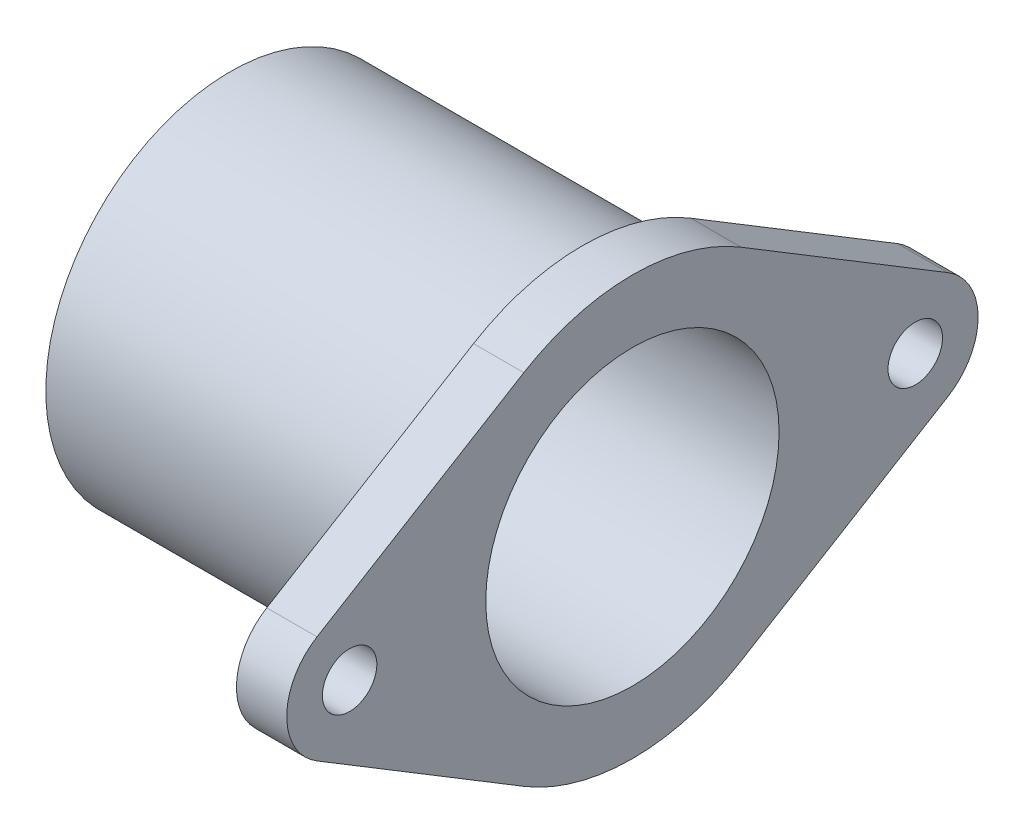
ISO-10303-21;
HEADER;
FILE_DESCRIPTION(('STEP AP214'),'2;1');
FILE_NAME('part.step','',(''),(''),'','','');
FILE_SCHEMA(('AUTOMOTIVE_DESIGN { 1 0 10303 214 1 1 1 1 }'));
ENDSEC;
DATA;
#1=APPLICATION_CONTEXT('core data for automotive mechanical design processes');
#2=APPLICATION_PROTOCOL_DEFINITION('international standard','automotive_design',2000,#1);
#3=PRODUCT_CONTEXT('',#1,'mechanical');
#4=PRODUCT('Part','Part','',(#3));
#5=PRODUCT_RELATED_PRODUCT_CATEGORY('part','',(#4));
#6=PRODUCT_DEFINITION_FORMATION('','',#4);
#7=PRODUCT_DEFINITION_CONTEXT('part definition',#1,'design');
#8=PRODUCT_DEFINITION('design','',#6,#7);
#9=PRODUCT_DEFINITION_SHAPE('','',#8);
#10=(LENGTH_UNIT() NAMED_UNIT(*) SI_UNIT(.MILLI.,.METRE.));
#11=(NAMED_UNIT(*) PLANE_ANGLE_UNIT() SI_UNIT($,.RADIAN.));
#12=(NAMED_UNIT(*) SI_UNIT($,.STERADIAN.) SOLID_ANGLE_UNIT());
#13=UNCERTAINTY_MEASURE_WITH_UNIT(LENGTH_MEASURE(1.E-05),#10,'distance_accuracy_value','');
#14=(GEOMETRIC_REPRESENTATION_CONTEXT(3) GLOBAL_UNCERTAINTY_ASSIGNED_CONTEXT((#13)) GLOBAL_UNIT_ASSIGNED_CONTEXT((#10,
#11,#12)) REPRESENTATION_CONTEXT('',''));
#15=CARTESIAN_POINT('',(0.,0.,0.));
#16=DIRECTION('',(0.,0.,1.));
#17=DIRECTION('',(1.,0.,0.));
#18=AXIS2_PLACEMENT_3D('',#15,#16,#17);
#19=CARTESIAN_POINT('',(84.,0.,0.));
#20=DIRECTION('',(-1.,0.,0.));
#21=DIRECTION('',(0.,0.,-0.999999999999999));
#22=AXIS2_PLACEMENT_3D('',#19,#20,#21);
#23=CYLINDRICAL_SURFACE('',#22,44.);
#24=CARTESIAN_POINT('',(84.,0.,0.));
#25=DIRECTION('',(-1.,0.,0.));
#26=DIRECTION('',(0.,0.,0.999999999999999));
#27=AXIS2_PLACEMENT_3D('',#24,#25,#26);
#28=CIRCLE('',#27,44.);
#29=CARTESIAN_POINT('',(84.,0.,-44.));
#30=VERTEX_POINT('',#29);
#31=EDGE_CURVE('E11',#30,#30,#28,.T.);
#32=CARTESIAN_POINT('',(0.,0.,0.));
#33=DIRECTION('',(-1.,0.,0.));
#34=DIRECTION('',(0.,0.,0.999999999999999));
#35=AXIS2_PLACEMENT_3D('',#32,#33,#34);
#36=CIRCLE('',#35,44.);
#37=CARTESIAN_POINT('',(0.,0.,-44.));
#38=VERTEX_POINT('',#37);
#39=EDGE_CURVE('E46',#38,#38,#36,.T.);
#40=CARTESIAN_POINT('',(84.,0.,-44.));
#41=CARTESIAN_POINT('',(83.125,0.,-44.));
#42=CARTESIAN_POINT('',(82.25,0.,-44.));
#43=CARTESIAN_POINT('',(80.5,0.,-44.));
#44=CARTESIAN_POINT('',(79.625,0.,-44.));
#45=CARTESIAN_POINT('',(77.875,0.,-44.));
#46=CARTESIAN_POINT('',(77.,0.,-44.));
#47=CARTESIAN_POINT('',(75.25,0.,-44.));
#48=CARTESIAN_POINT('',(74.375,0.,-44.));
#49=CARTESIAN_POINT('',(72.625,0.,-44.));
#50=CARTESIAN_POINT('',(71.75,0.,-44.));
#51=CARTESIAN_POINT('',(70.,0.,-44.));
#52=CARTESIAN_POINT('',(69.125,0.,-44.));
#53=CARTESIAN_POINT('',(67.375,0.,-44.));
#54=CARTESIAN_POINT('',(66.5,0.,-44.));
#55=CARTESIAN_POINT('',(64.75,0.,-44.));
#56=CARTESIAN_POINT('',(63.875,0.,-44.));
#57=CARTESIAN_POINT('',(62.125,0.,-44.));
#58=CARTESIAN_POINT('',(61.25,0.,-44.));
#59=CARTESIAN_POINT('',(59.5,0.,-44.));
#60=CARTESIAN_POINT('',(58.625,0.,-44.));
#61=CARTESIAN_POINT('',(56.875,0.,-44.));
#62=CARTESIAN_POINT('',(56.,0.,-44.));
#63=CARTESIAN_POINT('',(54.25,0.,-44.));
#64=CARTESIAN_POINT('',(53.375,0.,-44.));
#65=CARTESIAN_POINT('',(51.625,0.,-44.));
#66=CARTESIAN_POINT('',(50.75,0.,-44.));
#67=CARTESIAN_POINT('',(49.,0.,-44.));
#68=CARTESIAN_POINT('',(48.125,0.,-44.));
#69=CARTESIAN_POINT('',(46.375,0.,-44.));
#70=CARTESIAN_POINT('',(45.5,0.,-44.));
#71=CARTESIAN_POINT('',(43.75,0.,-44.));
#72=CARTESIAN_POINT('',(42.875,0.,-44.));
#73=CARTESIAN_POINT('',(41.125,0.,-44.));
#74=CARTESIAN_POINT('',(40.25,0.,-44.));
#75=CARTESIAN_POINT('',(38.5,0.,-44.));
#76=CARTESIAN_POINT('',(37.625,0.,-44.));
#77=CARTESIAN_POINT('',(35.875,0.,-44.));
#78=CARTESIAN_POINT('',(35.,0.,-44.));
#79=CARTESIAN_POINT('',(33.25,0.,-44.));
#80=CARTESIAN_POINT('',(32.375,0.,-44.));
#81=CARTESIAN_POINT('',(30.625,0.,-44.));
#82=CARTESIAN_POINT('',(29.75,0.,-44.));
#83=CARTESIAN_POINT('',(28.,0.,-44.));
#84=CARTESIAN_POINT('',(27.125,0.,-44.));
#85=CARTESIAN_POINT('',(25.375,0.,-44.));
#86=CARTESIAN_POINT('',(24.5,0.,-44.));
#87=CARTESIAN_POINT('',(22.75,0.,-44.));
#88=CARTESIAN_POINT('',(21.875,0.,-44.));
#89=CARTESIAN_POINT('',(20.125,0.,-44.));
#90=CARTESIAN_POINT('',(19.25,0.,-44.));
#91=CARTESIAN_POINT('',(17.5,0.,-44.));
#92=CARTESIAN_POINT('',(16.625,0.,-44.));
#93=CARTESIAN_POINT('',(14.875,0.,-44.));
#94=CARTESIAN_POINT('',(14.,0.,-44.));
#95=CARTESIAN_POINT('',(12.25,0.,-44.));
#96=CARTESIAN_POINT('',(11.375,0.,-44.));
#97=CARTESIAN_POINT('',(9.62499999999998,0.,-44.));
#98=CARTESIAN_POINT('',(8.74999999999998,0.,-44.));
#99=CARTESIAN_POINT('',(6.99999999999998,0.,-44.));
#100=CARTESIAN_POINT('',(6.12499999999999,0.,-44.));
#101=CARTESIAN_POINT('',(4.37499999999999,0.,-44.));
#102=CARTESIAN_POINT('',(3.49999999999999,0.,-44.));
#103=CARTESIAN_POINT('',(1.74999999999999,0.,-44.));
#104=CARTESIAN_POINT('',(0.874999999999986,0.,-44.));
#105=CARTESIAN_POINT('',(0.,0.,-44.));
#106=B_SPLINE_CURVE_WITH_KNOTS('',3,(#40,#41,#42,#43,#44,#45,#46,#47,#48,#49,#50,#51,#52,#53,
#54,#55,#56,#57,#58,#59,#60,#61,#62,#63,#64,#65,#66,#67,#68,#69,#70,#71,#72,#73,#74,#75,#76,#77,
#78,#79,#80,#81,#82,#83,#84,#85,#86,#87,#88,#89,#90,#91,#92,#93,#94,#95,#96,#97,#98,#99,#100,
#101,#102,#103,#104,#105),.UNSPECIFIED.,.F.,.F.,(4,2,2,2,2,2,2,2,2,2,2,2,2,2,2,2,2,2,2,2,2,2,2,
2,2,2,2,2,2,2,2,2,4),(0.,2.625,5.25,7.87500000000001,10.5,13.125,15.75,18.375,21.,23.625,26.25,
28.875,31.5,34.125,36.75,39.375,42.,44.625,47.25,49.875,52.5,55.125,57.75,60.375,63.,65.625,
68.25,70.875,73.5,76.125,78.75,81.375,84.),.UNSPECIFIED.);
#107=EDGE_CURVE('BSEAM37',#30,#38,#106,.T.);
#108=ORIENTED_EDGE('',*,*,#31,.T.);
#109=ORIENTED_EDGE('',*,*,#39,.F.);
#110=ORIENTED_EDGE('',*,*,#107,.T.);
#111=ORIENTED_EDGE('',*,*,#107,.F.);
#112=EDGE_LOOP('',(#108,#110,#109,#111));
#113=FACE_BOUND('',#112,.T.);
#114=ADVANCED_FACE('F37',(#113),#23,.T.);
#115=CARTESIAN_POINT('',(0.,0.,0.));
#116=DIRECTION('',(1.,0.,0.));
#117=DIRECTION('',(0.,0.,0.999999999999999));
#118=AXIS2_PLACEMENT_3D('',#115,#116,#117);
#119=PLANE('',#118);
#120=CARTESIAN_POINT('',(0.,0.,0.));
#121=DIRECTION('',(1.,0.,0.));
#122=DIRECTION('',(0.,0.,-0.999999999999999));
#123=AXIS2_PLACEMENT_3D('',#120,#121,#122);
#124=CIRCLE('',#123,25.25);
#125=CARTESIAN_POINT('',(0.,0.,-25.25));
#126=VERTEX_POINT('',#125);
#127=EDGE_CURVE('E251',#126,#126,#124,.T.);
#128=ORIENTED_EDGE('',*,*,#127,.T.);
#129=EDGE_LOOP('',(#128));
#130=FACE_BOUND('',#129,.T.);
#131=ORIENTED_EDGE('',*,*,#39,.T.);
#132=EDGE_LOOP('',(#131));
#133=FACE_BOUND('',#132,.T.);
#134=ADVANCED_FACE('F168',(#130,#133),#119,.F.);
#135=CARTESIAN_POINT('',(84.,0.,0.));
#136=DIRECTION('',(1.,0.,0.));
#137=DIRECTION('',(0.,0.,0.999999999999999));
#138=AXIS2_PLACEMENT_3D('',#135,#136,#137);
#139=PLANE('',#138);
#140=CARTESIAN_POINT('',(84.0000000000005,0.,-67.5000000000003));
#141=DIRECTION('',(-1.,0.,0.));
#142=DIRECTION('',(0.,0.,0.999999999999999));
#143=AXIS2_PLACEMENT_3D('',#140,#141,#142);
#144=CIRCLE('',#143,6.5);
#145=CARTESIAN_POINT('',(84.0000000000005,0.,-61.0000000000003));
#146=VERTEX_POINT('',#145);
#147=EDGE_CURVE('E239',#146,#146,#144,.T.);
#148=ORIENTED_EDGE('',*,*,#147,.F.);
#149=EDGE_LOOP('',(#148));
#150=FACE_BOUND('',#149,.T.);
#151=CARTESIAN_POINT('',(84.0000000000009,1.77635683940025E-12,67.4999999999963));
#152=DIRECTION('',(-1.,0.,0.));
#153=DIRECTION('',(0.,0.,0.999999999999999));
#154=AXIS2_PLACEMENT_3D('',#151,#152,#153);
#155=CIRCLE('',#154,6.5);
#156=CARTESIAN_POINT('',(84.0000000000009,1.77635683940025E-12,73.9999999999963));
#157=VERTEX_POINT('',#156);
#158=EDGE_CURVE('E137',#157,#157,#155,.T.);
#159=ORIENTED_EDGE('',*,*,#158,.F.);
#160=EDGE_LOOP('',(#159));
#161=FACE_BOUND('',#160,.T.);
#162=CARTESIAN_POINT('',(84.,0.,0.));
#163=DIRECTION('',(-1.,0.,0.));
#164=DIRECTION('',(0.,0.,0.999999999999999));
#165=AXIS2_PLACEMENT_3D('',#162,#163,#164);
#166=CIRCLE('',#165,50.);
#167=CARTESIAN_POINT('',(84.0000000000001,42.7533199282042,25.9259259259226));
#168=VERTEX_POINT('',#167);
#169=CARTESIAN_POINT('',(84.0000000000004,42.7533199282046,-25.9259259259292));
#170=VERTEX_POINT('',#169);
#171=EDGE_CURVE('E133',#168,#170,#166,.T.);
#172=ORIENTED_EDGE('',*,*,#171,.T.);
#173=DIRECTION('',(0.,-0.518518518518518,-0.855066398564088));
#174=VECTOR('',#173,1.);
#175=CARTESIAN_POINT('',(84.0000000000004,42.7533199282046,-25.9259259259292));
#176=LINE('',#175,#174);
#177=CARTESIAN_POINT('',(84.0000000000001,12.8259959784622,-75.2777777777793));
#178=VERTEX_POINT('',#177);
#179=EDGE_CURVE('E136',#170,#178,#176,.T.);
#180=ORIENTED_EDGE('',*,*,#179,.T.);
#181=CARTESIAN_POINT('',(84.0000000000005,0.,-67.5000000000003));
#182=DIRECTION('',(-1.,0.,0.));
#183=DIRECTION('',(0.,0.,0.999999999999999));
#184=AXIS2_PLACEMENT_3D('',#181,#182,#183);
#185=CIRCLE('',#184,15.);
#186=CARTESIAN_POINT('',(84.0000000000001,-12.8259959784596,-75.2777777777811));
#187=VERTEX_POINT('',#186);
#188=EDGE_CURVE('E140',#178,#187,#185,.T.);
#189=ORIENTED_EDGE('',*,*,#188,.T.);
#190=DIRECTION('',(0.,-0.518518518518516,0.855066398564088));
#191=VECTOR('',#190,1.);
#192=CARTESIAN_POINT('',(84.0000000000001,-12.8259959784596,-75.2777777777811));
#193=LINE('',#192,#191);
#194=CARTESIAN_POINT('',(84.0000000000013,-42.7533199282024,-25.9259259259292));
#195=VERTEX_POINT('',#194);
#196=EDGE_CURVE('E143',#187,#195,#193,.T.);
#197=ORIENTED_EDGE('',*,*,#196,.T.);
#198=CARTESIAN_POINT('',(84.,0.,0.));
#199=DIRECTION('',(-1.,0.,0.));
#200=DIRECTION('',(0.,0.,0.999999999999999));
#201=AXIS2_PLACEMENT_3D('',#198,#199,#200);
#202=CIRCLE('',#201,50.);
#203=CARTESIAN_POINT('',(84.000000000001,-42.7533199282033,25.9259259259226));
#204=VERTEX_POINT('',#203);
#205=EDGE_CURVE('E146',#195,#204,#202,.T.);
#206=ORIENTED_EDGE('',*,*,#205,.T.);
#207=DIRECTION('',(0.,0.518518518518519,0.855066398564088));
#208=VECTOR('',#207,1.);
#209=CARTESIAN_POINT('',(84.0000000000009,-12.8259959784631,75.2777777777784));
#210=LINE('',#209,#208);
#211=CARTESIAN_POINT('',(84.0000000000009,-12.8259959784631,75.2777777777784));
#212=VERTEX_POINT('',#211);
#213=EDGE_CURVE('E149',#204,#212,#210,.T.);
#214=ORIENTED_EDGE('',*,*,#213,.T.);
#215=CARTESIAN_POINT('',(84.0000000000009,1.77635683940025E-12,67.4999999999963));
#216=DIRECTION('',(-1.,0.,0.));
#217=DIRECTION('',(0.,0.,0.999999999999999));
#218=AXIS2_PLACEMENT_3D('',#215,#216,#217);
#219=CIRCLE('',#218,15.);
#220=CARTESIAN_POINT('',(84.0000000000009,12.8259959784649,75.2777777777744));
#221=VERTEX_POINT('',#220);
#222=EDGE_CURVE('E118',#212,#221,#219,.T.);
#223=ORIENTED_EDGE('',*,*,#222,.T.);
#224=DIRECTION('',(0.,0.518518518518517,-0.855066398564088));
#225=VECTOR('',#224,1.);
#226=CARTESIAN_POINT('',(84.0000000000001,42.7533199282042,25.9259259259226));
#227=LINE('',#226,#225);
#228=EDGE_CURVE('E152',#221,#168,#227,.T.);
#229=ORIENTED_EDGE('',*,*,#228,.T.);
#230=EDGE_LOOP('',(#172,#180,#189,#197,#206,#214,#223,#229));
#231=FACE_BOUND('',#230,.T.);
#232=ORIENTED_EDGE('',*,*,#31,.F.);
#233=EDGE_LOOP('',(#232));
#234=FACE_BOUND('',#233,.T.);
#235=ADVANCED_FACE('F175',(#150,#161,#231,#234),#139,.F.);
#236=CARTESIAN_POINT('',(96.,0.,0.));
#237=DIRECTION('',(-1.,0.,0.));
#238=DIRECTION('',(0.,0.,-0.999999999999999));
#239=AXIS2_PLACEMENT_3D('',#236,#237,#238);
#240=CYLINDRICAL_SURFACE('',#239,50.);
#241=ORIENTED_EDGE('',*,*,#171,.F.);
#242=DIRECTION('',(-1.,0.,0.));
#243=VECTOR('',#242,1.);
#244=CARTESIAN_POINT('',(96.0000000000004,42.7533199282042,25.9259259259226));
#245=LINE('',#244,#243);
#246=CARTESIAN_POINT('',(96.0000000000004,42.7533199282042,25.9259259259226));
#247=VERTEX_POINT('',#246);
#248=EDGE_CURVE('E87',#247,#168,#245,.T.);
#249=ORIENTED_EDGE('',*,*,#248,.F.);
#250=CARTESIAN_POINT('',(96.,0.,0.));
#251=DIRECTION('',(-1.,0.,0.));
#252=DIRECTION('',(0.,0.,0.999999999999999));
#253=AXIS2_PLACEMENT_3D('',#250,#251,#252);
#254=CIRCLE('',#253,50.);
#255=CARTESIAN_POINT('',(96.0000000000004,42.7533199282046,-25.9259259259292));
#256=VERTEX_POINT('',#255);
#257=EDGE_CURVE('E154',#247,#256,#254,.T.);
#258=ORIENTED_EDGE('',*,*,#257,.T.);
#259=DIRECTION('',(-1.,0.,0.));
#260=VECTOR('',#259,1.);
#261=CARTESIAN_POINT('',(96.0000000000004,42.7533199282046,-25.9259259259292));
#262=LINE('',#261,#260);
#263=EDGE_CURVE('E164',#256,#170,#262,.T.);
#264=ORIENTED_EDGE('',*,*,#263,.T.);
#265=EDGE_LOOP('',(#241,#249,#258,#264));
#266=FACE_BOUND('',#265,.T.);
#267=ADVANCED_FACE('F180',(#266),#240,.T.);
#268=CARTESIAN_POINT('',(96.0000000000004,42.7533199282046,-25.9259259259292));
#269=DIRECTION('',(0.,-0.855066398564088,0.518518518518518));
#270=DIRECTION('',(0.,0.518518518518518,0.855066398564088));
#271=AXIS2_PLACEMENT_3D('',#268,#269,#270);
#272=PLANE('',#271);
#273=ORIENTED_EDGE('',*,*,#179,.F.);
#274=ORIENTED_EDGE('',*,*,#263,.F.);
#275=DIRECTION('',(0.,-0.518518518518518,-0.855066398564088));
#276=VECTOR('',#275,1.);
#277=CARTESIAN_POINT('',(96.0000000000004,42.7533199282046,-25.9259259259292));
#278=LINE('',#277,#276);
#279=CARTESIAN_POINT('',(95.9999999999996,12.8259959784618,-75.2777777777793));
#280=VERTEX_POINT('',#279);
#281=EDGE_CURVE('E95',#256,#280,#278,.T.);
#282=ORIENTED_EDGE('',*,*,#281,.T.);
#283=DIRECTION('',(-1.,0.,0.));
#284=VECTOR('',#283,1.);
#285=CARTESIAN_POINT('',(95.9999999999996,12.8259959784618,-75.2777777777793));
#286=LINE('',#285,#284);
#287=EDGE_CURVE('E162',#280,#178,#286,.T.);
#288=ORIENTED_EDGE('',*,*,#287,.T.);
#289=EDGE_LOOP('',(#273,#274,#282,#288));
#290=FACE_BOUND('',#289,.T.);
#291=ADVANCED_FACE('F186',(#290),#272,.F.);
#292=CARTESIAN_POINT('',(96.0000000000005,0.,-67.5000000000003));
#293=DIRECTION('',(-1.,0.,0.));
#294=DIRECTION('',(0.,0.,-0.999999999999999));
#295=AXIS2_PLACEMENT_3D('',#292,#293,#294);
#296=CYLINDRICAL_SURFACE('',#295,15.);
#297=ORIENTED_EDGE('',*,*,#188,.F.);
#298=ORIENTED_EDGE('',*,*,#287,.F.);
#299=CARTESIAN_POINT('',(96.0000000000005,0.,-67.5000000000003));
#300=DIRECTION('',(-1.,0.,0.));
#301=DIRECTION('',(0.,0.,0.999999999999999));
#302=AXIS2_PLACEMENT_3D('',#299,#300,#301);
#303=CIRCLE('',#302,15.);
#304=CARTESIAN_POINT('',(95.9999999999996,-12.8259959784596,-75.2777777777811));
#305=VERTEX_POINT('',#304);
#306=EDGE_CURVE('E224',#280,#305,#303,.T.);
#307=ORIENTED_EDGE('',*,*,#306,.T.);
#308=DIRECTION('',(-1.,0.,0.));
#309=VECTOR('',#308,1.);
#310=CARTESIAN_POINT('',(95.9999999999996,-12.8259959784596,-75.2777777777811));
#311=LINE('',#310,#309);
#312=EDGE_CURVE('E160',#305,#187,#311,.T.);
#313=ORIENTED_EDGE('',*,*,#312,.T.);
#314=EDGE_LOOP('',(#297,#298,#307,#313));
#315=FACE_BOUND('',#314,.T.);
#316=ADVANCED_FACE('F208',(#315),#296,.T.);
#317=CARTESIAN_POINT('',(95.9999999999996,-12.8259959784596,-75.2777777777811));
#318=DIRECTION('',(0.,0.855066398564088,0.518518518518516));
#319=DIRECTION('',(0.,0.518518518518517,-0.855066398564088));
#320=AXIS2_PLACEMENT_3D('',#317,#318,#319);
#321=PLANE('',#320);
#322=ORIENTED_EDGE('',*,*,#196,.F.);
#323=ORIENTED_EDGE('',*,*,#312,.F.);
#324=DIRECTION('',(0.,-0.518518518518516,0.855066398564088));
#325=VECTOR('',#324,1.);
#326=CARTESIAN_POINT('',(95.9999999999996,-12.8259959784596,-75.2777777777811));
#327=LINE('',#326,#325);
#328=CARTESIAN_POINT('',(96.0000000000013,-42.7533199282024,-25.9259259259292));
#329=VERTEX_POINT('',#328);
#330=EDGE_CURVE('E128',#305,#329,#327,.T.);
#331=ORIENTED_EDGE('',*,*,#330,.T.);
#332=DIRECTION('',(-1.,0.,0.));
#333=VECTOR('',#332,1.);
#334=CARTESIAN_POINT('',(96.0000000000013,-42.7533199282024,-25.9259259259292));
#335=LINE('',#334,#333);
#336=EDGE_CURVE('E158',#329,#195,#335,.T.);
#337=ORIENTED_EDGE('',*,*,#336,.T.);
#338=EDGE_LOOP('',(#322,#323,#331,#337));
#339=FACE_BOUND('',#338,.T.);
#340=ADVANCED_FACE('F204',(#339),#321,.F.);
#341=CARTESIAN_POINT('',(96.,0.,0.));
#342=DIRECTION('',(-1.,0.,0.));
#343=DIRECTION('',(0.,0.,-0.999999999999999));
#344=AXIS2_PLACEMENT_3D('',#341,#342,#343);
#345=CYLINDRICAL_SURFACE('',#344,50.);
#346=ORIENTED_EDGE('',*,*,#205,.F.);
#347=ORIENTED_EDGE('',*,*,#336,.F.);
#348=CARTESIAN_POINT('',(96.,0.,0.));
#349=DIRECTION('',(-1.,0.,0.));
#350=DIRECTION('',(0.,0.,0.999999999999999));
#351=AXIS2_PLACEMENT_3D('',#348,#349,#350);
#352=CIRCLE('',#351,50.);
#353=CARTESIAN_POINT('',(96.0000000000013,-42.7533199282033,25.9259259259226));
#354=VERTEX_POINT('',#353);
#355=EDGE_CURVE('E126',#329,#354,#352,.T.);
#356=ORIENTED_EDGE('',*,*,#355,.T.);
#357=DIRECTION('',(-1.,0.,0.));
#358=VECTOR('',#357,1.);
#359=CARTESIAN_POINT('',(96.0000000000013,-42.7533199282033,25.9259259259226));
#360=LINE('',#359,#358);
#361=EDGE_CURVE('E122',#354,#204,#360,.T.);
#362=ORIENTED_EDGE('',*,*,#361,.T.);
#363=EDGE_LOOP('',(#346,#347,#356,#362));
#364=FACE_BOUND('',#363,.T.);
#365=ADVANCED_FACE('F201',(#364),#345,.T.);
#366=CARTESIAN_POINT('',(96.0000000000004,-12.8259959784631,75.2777777777776));
#367=DIRECTION('',(0.,0.855066398564088,-0.518518518518518));
#368=DIRECTION('',(0.,-0.518518518518519,-0.855066398564088));
#369=AXIS2_PLACEMENT_3D('',#366,#367,#368);
#370=PLANE('',#369);
#371=ORIENTED_EDGE('',*,*,#213,.F.);
#372=ORIENTED_EDGE('',*,*,#361,.F.);
#373=DIRECTION('',(0.,0.518518518518519,0.855066398564088));
#374=VECTOR('',#373,1.);
#375=CARTESIAN_POINT('',(96.0000000000004,-12.8259959784631,75.2777777777776));
#376=LINE('',#375,#374);
#377=CARTESIAN_POINT('',(96.0000000000004,-12.8259959784631,75.2777777777776));
#378=VERTEX_POINT('',#377);
#379=EDGE_CURVE('E112',#354,#378,#376,.T.);
#380=ORIENTED_EDGE('',*,*,#379,.T.);
#381=DIRECTION('',(-1.,0.,0.));
#382=VECTOR('',#381,1.);
#383=CARTESIAN_POINT('',(96.0000000000004,-12.8259959784631,75.2777777777776));
#384=LINE('',#383,#382);
#385=EDGE_CURVE('E115',#378,#212,#384,.T.);
#386=ORIENTED_EDGE('',*,*,#385,.T.);
#387=EDGE_LOOP('',(#371,#372,#380,#386));
#388=FACE_BOUND('',#387,.T.);
#389=ADVANCED_FACE('F124',(#388),#370,.F.);
#390=CARTESIAN_POINT('',(96.0000000000009,1.77635683940025E-12,67.4999999999963));
#391=DIRECTION('',(-1.,0.,0.));
#392=DIRECTION('',(0.,0.,-0.999999999999999));
#393=AXIS2_PLACEMENT_3D('',#390,#391,#392);
#394=CYLINDRICAL_SURFACE('',#393,15.);
#395=ORIENTED_EDGE('',*,*,#222,.F.);
#396=ORIENTED_EDGE('',*,*,#385,.F.);
#397=CARTESIAN_POINT('',(96.0000000000009,1.77635683940025E-12,67.4999999999963));
#398=DIRECTION('',(-1.,0.,0.));
#399=DIRECTION('',(0.,0.,0.999999999999999));
#400=AXIS2_PLACEMENT_3D('',#397,#398,#399);
#401=CIRCLE('',#400,15.);
#402=CARTESIAN_POINT('',(96.0000000000004,12.8259959784649,75.2777777777744));
#403=VERTEX_POINT('',#402);
#404=EDGE_CURVE('E108',#378,#403,#401,.T.);
#405=ORIENTED_EDGE('',*,*,#404,.T.);
#406=DIRECTION('',(-1.,0.,0.));
#407=VECTOR('',#406,1.);
#408=CARTESIAN_POINT('',(96.0000000000004,12.8259959784649,75.2777777777744));
#409=LINE('',#408,#407);
#410=EDGE_CURVE('E83',#403,#221,#409,.T.);
#411=ORIENTED_EDGE('',*,*,#410,.T.);
#412=EDGE_LOOP('',(#395,#396,#405,#411));
#413=FACE_BOUND('',#412,.T.);
#414=ADVANCED_FACE('F116',(#413),#394,.T.);
#415=CARTESIAN_POINT('',(96.0000000000004,42.7533199282042,25.9259259259226));
#416=DIRECTION('',(0.,-0.855066398564088,-0.518518518518517));
#417=DIRECTION('',(0.,-0.518518518518517,0.855066398564088));
#418=AXIS2_PLACEMENT_3D('',#415,#416,#417);
#419=PLANE('',#418);
#420=ORIENTED_EDGE('',*,*,#228,.F.);
#421=ORIENTED_EDGE('',*,*,#410,.F.);
#422=DIRECTION('',(0.,0.518518518518517,-0.855066398564088));
#423=VECTOR('',#422,1.);
#424=CARTESIAN_POINT('',(96.0000000000004,42.7533199282042,25.9259259259226));
#425=LINE('',#424,#423);
#426=EDGE_CURVE('E55',#403,#247,#425,.T.);
#427=ORIENTED_EDGE('',*,*,#426,.T.);
#428=ORIENTED_EDGE('',*,*,#248,.T.);
#429=EDGE_LOOP('',(#420,#421,#427,#428));
#430=FACE_BOUND('',#429,.T.);
#431=ADVANCED_FACE('F194',(#430),#419,.F.);
#432=CARTESIAN_POINT('',(96.,0.,0.));
#433=DIRECTION('',(1.,0.,0.));
#434=DIRECTION('',(0.,0.,0.999999999999999));
#435=AXIS2_PLACEMENT_3D('',#432,#433,#434);
#436=PLANE('',#435);
#437=CARTESIAN_POINT('',(96.,0.,0.));
#438=DIRECTION('',(-1.,0.,0.));
#439=DIRECTION('',(0.,0.,0.999999999999999));
#440=AXIS2_PLACEMENT_3D('',#437,#438,#439);
#441=CIRCLE('',#440,35.);
#442=CARTESIAN_POINT('',(96.,0.,35.));
#443=VERTEX_POINT('',#442);
#444=EDGE_CURVE('E246',#443,#443,#441,.T.);
#445=ORIENTED_EDGE('',*,*,#444,.T.);
#446=EDGE_LOOP('',(#445));
#447=FACE_BOUND('',#446,.T.);
#448=CARTESIAN_POINT('',(96.0000000000005,0.,-67.5000000000003));
#449=DIRECTION('',(-1.,0.,0.));
#450=DIRECTION('',(0.,0.,0.999999999999999));
#451=AXIS2_PLACEMENT_3D('',#448,#449,#450);
#452=CIRCLE('',#451,6.5);
#453=CARTESIAN_POINT('',(96.0000000000005,0.,-61.0000000000003));
#454=VERTEX_POINT('',#453);
#455=EDGE_CURVE('E242',#454,#454,#452,.T.);
#456=ORIENTED_EDGE('',*,*,#455,.T.);
#457=EDGE_LOOP('',(#456));
#458=FACE_BOUND('',#457,.T.);
#459=CARTESIAN_POINT('',(96.0000000000009,1.77635683940025E-12,67.4999999999963));
#460=DIRECTION('',(-1.,0.,0.));
#461=DIRECTION('',(0.,0.,0.999999999999999));
#462=AXIS2_PLACEMENT_3D('',#459,#460,#461);
#463=CIRCLE('',#462,6.5);
#464=CARTESIAN_POINT('',(96.0000000000009,1.77635683940025E-12,73.9999999999963));
#465=VERTEX_POINT('',#464);
#466=EDGE_CURVE('E236',#465,#465,#463,.T.);
#467=ORIENTED_EDGE('',*,*,#466,.T.);
#468=EDGE_LOOP('',(#467));
#469=FACE_BOUND('',#468,.T.);
#470=ORIENTED_EDGE('',*,*,#257,.F.);
#471=ORIENTED_EDGE('',*,*,#426,.F.);
#472=ORIENTED_EDGE('',*,*,#404,.F.);
#473=ORIENTED_EDGE('',*,*,#379,.F.);
#474=ORIENTED_EDGE('',*,*,#355,.F.);
#475=ORIENTED_EDGE('',*,*,#330,.F.);
#476=ORIENTED_EDGE('',*,*,#306,.F.);
#477=ORIENTED_EDGE('',*,*,#281,.F.);
#478=EDGE_LOOP('',(#470,#471,#472,#473,#474,#475,#476,#477));
#479=FACE_BOUND('',#478,.T.);
#480=ADVANCED_FACE('F110',(#447,#458,#469,#479),#436,.T.);
#481=CARTESIAN_POINT('',(16.0000000000008,1.33226762955019E-12,67.4999999999963));
#482=DIRECTION('',(1.,0.,0.));
#483=DIRECTION('',(0.,0.,0.999999999999999));
#484=AXIS2_PLACEMENT_3D('',#481,#482,#483);
#485=CYLINDRICAL_SURFACE('',#484,6.5);
#486=ORIENTED_EDGE('',*,*,#466,.F.);
#487=EDGE_LOOP('',(#486));
#488=FACE_BOUND('',#487,.T.);
#489=ORIENTED_EDGE('',*,*,#158,.T.);
#490=EDGE_LOOP('',(#489));
#491=FACE_BOUND('',#490,.T.);
#492=ADVANCED_FACE('F275',(#488,#491),#485,.F.);
#493=CARTESIAN_POINT('',(16.,0.,-67.4999999999999));
#494=DIRECTION('',(1.,0.,0.));
#495=DIRECTION('',(0.,0.,0.999999999999999));
#496=AXIS2_PLACEMENT_3D('',#493,#494,#495);
#497=CYLINDRICAL_SURFACE('',#496,6.5);
#498=ORIENTED_EDGE('',*,*,#455,.F.);
#499=EDGE_LOOP('',(#498));
#500=FACE_BOUND('',#499,.T.);
#501=ORIENTED_EDGE('',*,*,#147,.T.);
#502=EDGE_LOOP('',(#501));
#503=FACE_BOUND('',#502,.T.);
#504=ADVANCED_FACE('F272',(#500,#503),#497,.F.);
#505=CARTESIAN_POINT('',(11.,0.,0.));
#506=DIRECTION('',(1.,0.,0.));
#507=DIRECTION('',(0.,0.,0.999999999999999));
#508=AXIS2_PLACEMENT_3D('',#505,#506,#507);
#509=CYLINDRICAL_SURFACE('',#508,35.);
#510=CARTESIAN_POINT('',(11.,0.,0.));
#511=DIRECTION('',(-1.,0.,0.));
#512=DIRECTION('',(0.,0.,0.999999999999999));
#513=AXIS2_PLACEMENT_3D('',#510,#511,#512);
#514=CIRCLE('',#513,35.);
#515=CARTESIAN_POINT('',(11.,0.,35.));
#516=VERTEX_POINT('',#515);
#517=EDGE_CURVE('E245',#516,#516,#514,.T.);
#518=ORIENTED_EDGE('',*,*,#517,.T.);
#519=EDGE_LOOP('',(#518));
#520=FACE_BOUND('',#519,.T.);
#521=ORIENTED_EDGE('',*,*,#444,.F.);
#522=EDGE_LOOP('',(#521));
#523=FACE_BOUND('',#522,.T.);
#524=ADVANCED_FACE('F267',(#520,#523),#509,.F.);
#525=CARTESIAN_POINT('',(11.,0.,0.));
#526=DIRECTION('',(1.,0.,0.));
#527=DIRECTION('',(0.,0.,0.999999999999999));
#528=AXIS2_PLACEMENT_3D('',#525,#526,#527);
#529=PLANE('',#528);
#530=CARTESIAN_POINT('',(11.,0.,0.));
#531=DIRECTION('',(-1.,0.,0.));
#532=DIRECTION('',(0.,0.,0.999999999999999));
#533=AXIS2_PLACEMENT_3D('',#530,#531,#532);
#534=CIRCLE('',#533,25.25);
#535=CARTESIAN_POINT('',(11.,0.,25.25));
#536=VERTEX_POINT('',#535);
#537=EDGE_CURVE('E40',#536,#536,#534,.T.);
#538=ORIENTED_EDGE('',*,*,#537,.T.);
#539=EDGE_LOOP('',(#538));
#540=FACE_BOUND('',#539,.T.);
#541=ORIENTED_EDGE('',*,*,#517,.F.);
#542=EDGE_LOOP('',(#541));
#543=FACE_BOUND('',#542,.T.);
#544=ADVANCED_FACE('F257',(#540,#543),#529,.T.);
#545=CARTESIAN_POINT('',(85.,0.,0.));
#546=DIRECTION('',(-1.,0.,0.));
#547=DIRECTION('',(0.,0.,-0.999999999999999));
#548=AXIS2_PLACEMENT_3D('',#545,#546,#547);
#549=CYLINDRICAL_SURFACE('',#548,25.25);
#550=ORIENTED_EDGE('',*,*,#537,.F.);
#551=EDGE_LOOP('',(#550));
#552=FACE_BOUND('',#551,.T.);
#553=ORIENTED_EDGE('',*,*,#127,.F.);
#554=EDGE_LOOP('',(#553));
#555=FACE_BOUND('',#554,.T.);
#556=ADVANCED_FACE('F260',(#552,#555),#549,.F.);
#557=CLOSED_SHELL('',(#114,#134,#235,#267,#291,#316,#340,#365,#389,#414,#431,#480,#492,#504,
#524,#544,#556));
#558=MANIFOLD_SOLID_BREP('B2',#557);
#559=ADVANCED_BREP_SHAPE_REPRESENTATION('',(#18,#558),#14);
#560=SHAPE_DEFINITION_REPRESENTATION(#9,#559);
ENDSEC;
END-ISO-10303-21;
